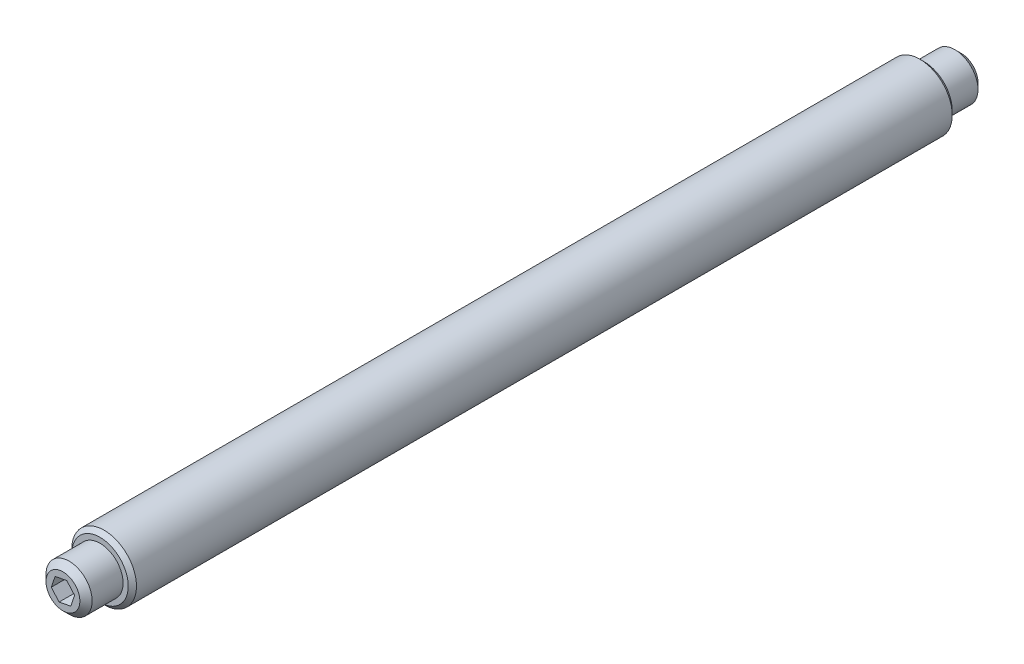
ISO-10303-21;
HEADER;
FILE_DESCRIPTION(('STEP AP214'),'2;1');
FILE_NAME('part.step','',(''),(''),'','','');
FILE_SCHEMA(('AUTOMOTIVE_DESIGN { 1 0 10303 214 1 1 1 1 }'));
ENDSEC;
DATA;
#1=APPLICATION_CONTEXT('core data for automotive mechanical design processes');
#2=APPLICATION_PROTOCOL_DEFINITION('international standard','automotive_design',2000,#1);
#3=PRODUCT_CONTEXT('',#1,'mechanical');
#4=PRODUCT('Part','Part','',(#3));
#5=PRODUCT_RELATED_PRODUCT_CATEGORY('part','',(#4));
#6=PRODUCT_DEFINITION_FORMATION('','',#4);
#7=PRODUCT_DEFINITION_CONTEXT('part definition',#1,'design');
#8=PRODUCT_DEFINITION('design','',#6,#7);
#9=PRODUCT_DEFINITION_SHAPE('','',#8);
#10=(LENGTH_UNIT() NAMED_UNIT(*) SI_UNIT(.MILLI.,.METRE.));
#11=(NAMED_UNIT(*) PLANE_ANGLE_UNIT() SI_UNIT($,.RADIAN.));
#12=(NAMED_UNIT(*) SI_UNIT($,.STERADIAN.) SOLID_ANGLE_UNIT());
#13=UNCERTAINTY_MEASURE_WITH_UNIT(LENGTH_MEASURE(1.E-05),#10,'distance_accuracy_value','');
#14=(GEOMETRIC_REPRESENTATION_CONTEXT(3) GLOBAL_UNCERTAINTY_ASSIGNED_CONTEXT((#13)) GLOBAL_UNIT_ASSIGNED_CONTEXT((#10,
#11,#12)) REPRESENTATION_CONTEXT('',''));
#15=CARTESIAN_POINT('',(0.,0.,0.));
#16=DIRECTION('',(0.,0.,1.));
#17=DIRECTION('',(1.,0.,0.));
#18=AXIS2_PLACEMENT_3D('',#15,#16,#17);
#19=CARTESIAN_POINT('',(0.,0.,-27.686));
#20=DIRECTION('',(0.,0.,-1.));
#21=DIRECTION('',(0.581899768914632,-0.813260511113812,0.));
#22=AXIS2_PLACEMENT_3D('',#19,#20,#21);
#23=PLANE('',#22);
#24=CARTESIAN_POINT('',(0.,0.,-27.686));
#25=DIRECTION('',(0.,0.,-1.));
#26=DIRECTION('',(0.581899768914632,-0.813260511113812,0.));
#27=AXIS2_PLACEMENT_3D('',#24,#25,#26);
#28=CIRCLE('',#27,1.04394);
#29=CARTESIAN_POINT('',(0.607468444760741,-0.848995177972151,-27.686));
#30=VERTEX_POINT('',#29);
#31=EDGE_CURVE('P0_E11',#30,#30,#28,.T.);
#32=ORIENTED_EDGE('',*,*,#31,.T.);
#33=EDGE_LOOP('',(#32));
#34=FACE_BOUND('',#33,.T.);
#35=DIRECTION('',(-0.581899768914632,0.813260511113812,0.));
#36=VECTOR('',#35,1.);
#37=CARTESIAN_POINT('',(-0.303085832034879,-0.667661824393953,-27.686));
#38=LINE('',#37,#36);
#39=CARTESIAN_POINT('',(-0.303085832034879,-0.667661824393953,-27.686));
#40=VERTEX_POINT('',#39);
#41=CARTESIAN_POINT('',(-0.729755017079668,-0.0713508821276313,-27.686));
#42=VERTEX_POINT('',#41);
#43=EDGE_CURVE('P0_E78',#40,#42,#38,.T.);
#44=ORIENTED_EDGE('',*,*,#43,.F.);
#45=DIRECTION('',(0.995254146976594,0.0973097267794597,0.));
#46=VECTOR('',#45,1.);
#47=CARTESIAN_POINT('',(-0.303085832034879,-0.667661824393953,-27.686));
#48=LINE('',#47,#46);
#49=CARTESIAN_POINT('',(0.426669185044786,-0.596310942266323,-27.686));
#50=VERTEX_POINT('',#49);
#51=EDGE_CURVE('P0_E31',#40,#50,#48,.T.);
#52=ORIENTED_EDGE('',*,*,#51,.T.);
#53=DIRECTION('',(-0.413354378061962,-0.910570237893272,0.));
#54=VECTOR('',#53,1.);
#55=CARTESIAN_POINT('',(0.729755017079662,0.0713508821276294,-27.686));
#56=LINE('',#55,#54);
#57=CARTESIAN_POINT('',(0.729755017079662,0.0713508821276294,-27.686));
#58=VERTEX_POINT('',#57);
#59=EDGE_CURVE('P0_E84',#58,#50,#56,.T.);
#60=ORIENTED_EDGE('',*,*,#59,.F.);
#61=DIRECTION('',(-0.581899768914632,0.813260511113812,0.));
#62=VECTOR('',#61,1.);
#63=CARTESIAN_POINT('',(0.729755017079662,0.0713508821276294,-27.686));
#64=LINE('',#63,#62);
#65=CARTESIAN_POINT('',(0.303085832034872,0.667661824393951,-27.686));
#66=VERTEX_POINT('',#65);
#67=EDGE_CURVE('P0_E104',#58,#66,#64,.T.);
#68=ORIENTED_EDGE('',*,*,#67,.T.);
#69=DIRECTION('',(-0.995254146976594,-0.0973097267794598,0.));
#70=VECTOR('',#69,1.);
#71=CARTESIAN_POINT('',(0.303085832034872,0.667661824393951,-27.686));
#72=LINE('',#71,#70);
#73=CARTESIAN_POINT('',(-0.426669185044793,0.596310942266321,-27.686));
#74=VERTEX_POINT('',#73);
#75=EDGE_CURVE('P0_E107',#66,#74,#72,.T.);
#76=ORIENTED_EDGE('',*,*,#75,.T.);
#77=DIRECTION('',(0.413354378061962,0.910570237893272,0.));
#78=VECTOR('',#77,1.);
#79=CARTESIAN_POINT('',(-0.729755017079668,-0.0713508821276313,-27.686));
#80=LINE('',#79,#78);
#81=EDGE_CURVE('P0_E110',#42,#74,#80,.T.);
#82=ORIENTED_EDGE('',*,*,#81,.F.);
#83=EDGE_LOOP('',(#44,#52,#60,#68,#76,#82));
#84=FACE_BOUND('',#83,.T.);
#85=ADVANCED_FACE('P0_F17',(#34,#84),#23,.T.);
#86=CARTESIAN_POINT('',(0.,0.,-27.686));
#87=DIRECTION('',(0.,0.,1.));
#88=DIRECTION('',(-0.581899768914632,0.813260511113812,0.));
#89=AXIS2_PLACEMENT_3D('',#86,#87,#88);
#90=CONICAL_SURFACE('',#89,1.04394,0.785398163397426);
#91=CARTESIAN_POINT('',(0.,0.,-27.30754));
#92=DIRECTION('',(0.,0.,-1.));
#93=DIRECTION('',(0.581899768914632,-0.813260511113812,0.));
#94=AXIS2_PLACEMENT_3D('',#91,#92,#93);
#95=CIRCLE('',#94,1.4224);
#96=CARTESIAN_POINT('',(0.827694231304173,-1.15678175100828,-27.30754));
#97=VERTEX_POINT('',#96);
#98=EDGE_CURVE('P0_E24',#97,#97,#95,.T.);
#99=ORIENTED_EDGE('',*,*,#98,.T.);
#100=EDGE_LOOP('',(#99));
#101=FACE_BOUND('',#100,.T.);
#102=ORIENTED_EDGE('',*,*,#31,.F.);
#103=EDGE_LOOP('',(#102));
#104=FACE_BOUND('',#103,.T.);
#105=ADVANCED_FACE('P0_F130',(#101,#104),#90,.T.);
#106=CARTESIAN_POINT('',(0.,0.,-40.386));
#107=DIRECTION('',(0.,0.,-1.));
#108=DIRECTION('',(0.581899768914632,-0.813260511113812,0.));
#109=AXIS2_PLACEMENT_3D('',#106,#107,#108);
#110=CYLINDRICAL_SURFACE('',#109,1.4224);
#111=CARTESIAN_POINT('',(0.,0.,-21.9837));
#112=DIRECTION('',(0.,0.,-1.));
#113=DIRECTION('',(0.581899768914632,-0.813260511113812,0.));
#114=AXIS2_PLACEMENT_3D('',#111,#112,#113);
#115=CIRCLE('',#114,1.4224);
#116=CARTESIAN_POINT('',(0.827694231304173,-1.15678175100828,-21.9837));
#117=VERTEX_POINT('',#116);
#118=EDGE_CURVE('P0_E125',#117,#117,#115,.T.);
#119=ORIENTED_EDGE('',*,*,#118,.T.);
#120=EDGE_LOOP('',(#119));
#121=FACE_BOUND('',#120,.T.);
#122=ORIENTED_EDGE('',*,*,#98,.F.);
#123=EDGE_LOOP('',(#122));
#124=FACE_BOUND('',#123,.T.);
#125=ADVANCED_FACE('P0_F133',(#121,#124),#110,.T.);
#126=CARTESIAN_POINT('',(0.,0.,-21.9837));
#127=DIRECTION('',(0.,0.,-1.));
#128=DIRECTION('',(0.581899768914632,-0.813260511113812,0.));
#129=AXIS2_PLACEMENT_3D('',#126,#127,#128);
#130=CONICAL_SURFACE('',#129,1.4224,0.785398163397453);
#131=CARTESIAN_POINT('',(0.,0.,-21.336));
#132=DIRECTION('',(0.,0.,-1.));
#133=DIRECTION('',(0.581899768914632,-0.813260511113812,0.));
#134=AXIS2_PLACEMENT_3D('',#131,#132,#133);
#135=CIRCLE('',#134,0.7747);
#136=CARTESIAN_POINT('',(0.450797750978165,-0.630032917959867,-21.336));
#137=VERTEX_POINT('',#136);
#138=EDGE_CURVE('P0_E85',#137,#137,#135,.T.);
#139=ORIENTED_EDGE('',*,*,#138,.T.);
#140=EDGE_LOOP('',(#139));
#141=FACE_BOUND('',#140,.T.);
#142=ORIENTED_EDGE('',*,*,#118,.F.);
#143=EDGE_LOOP('',(#142));
#144=FACE_BOUND('',#143,.T.);
#145=ADVANCED_FACE('P0_F135',(#141,#144),#130,.T.);
#146=CARTESIAN_POINT('',(0.,0.,-21.8014867215606));
#147=DIRECTION('',(0.,0.,1.));
#148=DIRECTION('',(-0.581899768914632,0.813260511113812,0.));
#149=AXIS2_PLACEMENT_3D('',#146,#147,#148);
#150=CONICAL_SURFACE('',#149,0.,1.02974425867666);
#151=ORIENTED_EDGE('',*,*,#138,.F.);
#152=EDGE_LOOP('',(#151));
#153=FACE_BOUND('',#152,.T.);
#154=CARTESIAN_POINT('',(0.,0.,-21.8014867215606));
#155=VERTEX_POINT('',#154);
#156=VERTEX_LOOP('',#155);
#157=FACE_BOUND('',#156,.T.);
#158=ADVANCED_FACE('P0_F143',(#153,#157),#150,.F.);
#159=CARTESIAN_POINT('',(-0.303085832034879,-0.667661824393953,-25.908));
#160=DIRECTION('',(-0.0973097267794596,0.995254146976594,0.));
#161=DIRECTION('',(-0.995254146976594,-0.0973097267794596,0.));
#162=AXIS2_PLACEMENT_3D('',#159,#160,#161);
#163=PLANE('',#162);
#164=ORIENTED_EDGE('',*,*,#51,.F.);
#165=DIRECTION('',(0.,0.,-1.));
#166=VECTOR('',#165,1.);
#167=CARTESIAN_POINT('',(-0.303085832034879,-0.667661824393953,-25.908));
#168=LINE('',#167,#166);
#169=CARTESIAN_POINT('',(-0.303085832034879,-0.667661824393953,-25.908));
#170=VERTEX_POINT('',#169);
#171=EDGE_CURVE('P0_E72',#170,#40,#168,.T.);
#172=ORIENTED_EDGE('',*,*,#171,.F.);
#173=DIRECTION('',(0.995254146976594,0.0973097267794597,0.));
#174=VECTOR('',#173,1.);
#175=CARTESIAN_POINT('',(-0.303085832034879,-0.667661824393953,-25.908));
#176=LINE('',#175,#174);
#177=CARTESIAN_POINT('',(0.426669185044786,-0.596310942266323,-25.908));
#178=VERTEX_POINT('',#177);
#179=EDGE_CURVE('P0_E67',#170,#178,#176,.T.);
#180=ORIENTED_EDGE('',*,*,#179,.T.);
#181=DIRECTION('',(0.,0.,-1.));
#182=VECTOR('',#181,1.);
#183=CARTESIAN_POINT('',(0.426669185044786,-0.596310942266323,-25.908));
#184=LINE('',#183,#182);
#185=EDGE_CURVE('P0_E70',#178,#50,#184,.T.);
#186=ORIENTED_EDGE('',*,*,#185,.T.);
#187=EDGE_LOOP('',(#164,#172,#180,#186));
#188=FACE_BOUND('',#187,.T.);
#189=ADVANCED_FACE('P0_F69',(#188),#163,.T.);
#190=CARTESIAN_POINT('',(0.729755017079662,0.0713508821276297,-25.908));
#191=DIRECTION('',(0.910570237893272,-0.413354378061961,0.));
#192=DIRECTION('',(0.413354378061962,0.910570237893272,0.));
#193=AXIS2_PLACEMENT_3D('',#190,#191,#192);
#194=PLANE('',#193);
#195=ORIENTED_EDGE('',*,*,#59,.T.);
#196=ORIENTED_EDGE('',*,*,#185,.F.);
#197=DIRECTION('',(-0.413354378061962,-0.910570237893272,0.));
#198=VECTOR('',#197,1.);
#199=CARTESIAN_POINT('',(0.729755017079662,0.0713508821276297,-25.908));
#200=LINE('',#199,#198);
#201=CARTESIAN_POINT('',(0.729755017079662,0.0713508821276297,-25.908));
#202=VERTEX_POINT('',#201);
#203=EDGE_CURVE('P0_E77',#202,#178,#200,.T.);
#204=ORIENTED_EDGE('',*,*,#203,.F.);
#205=DIRECTION('',(0.,0.,-1.));
#206=VECTOR('',#205,1.);
#207=CARTESIAN_POINT('',(0.729755017079662,0.0713508821276297,-25.908));
#208=LINE('',#207,#206);
#209=EDGE_CURVE('P0_E86',#202,#58,#208,.T.);
#210=ORIENTED_EDGE('',*,*,#209,.T.);
#211=EDGE_LOOP('',(#195,#196,#204,#210));
#212=FACE_BOUND('',#211,.T.);
#213=ADVANCED_FACE('P0_F82',(#212),#194,.F.);
#214=CARTESIAN_POINT('',(0.729755017079662,0.0713508821276297,-25.908));
#215=DIRECTION('',(-0.813260511113812,-0.581899768914632,0.));
#216=DIRECTION('',(0.581899768914632,-0.813260511113812,0.));
#217=AXIS2_PLACEMENT_3D('',#214,#215,#216);
#218=PLANE('',#217);
#219=ORIENTED_EDGE('',*,*,#67,.F.);
#220=ORIENTED_EDGE('',*,*,#209,.F.);
#221=DIRECTION('',(-0.581899768914632,0.813260511113812,0.));
#222=VECTOR('',#221,1.);
#223=CARTESIAN_POINT('',(0.729755017079662,0.0713508821276297,-25.908));
#224=LINE('',#223,#222);
#225=CARTESIAN_POINT('',(0.303085832034872,0.667661824393951,-25.908));
#226=VERTEX_POINT('',#225);
#227=EDGE_CURVE('P0_E91',#202,#226,#224,.T.);
#228=ORIENTED_EDGE('',*,*,#227,.T.);
#229=DIRECTION('',(0.,0.,-1.));
#230=VECTOR('',#229,1.);
#231=CARTESIAN_POINT('',(0.303085832034872,0.667661824393951,-25.908));
#232=LINE('',#231,#230);
#233=EDGE_CURVE('P0_E120',#226,#66,#232,.T.);
#234=ORIENTED_EDGE('',*,*,#233,.T.);
#235=EDGE_LOOP('',(#219,#220,#228,#234));
#236=FACE_BOUND('',#235,.T.);
#237=ADVANCED_FACE('P0_F166',(#236),#218,.T.);
#238=CARTESIAN_POINT('',(0.303085832034872,0.667661824393951,-25.908));
#239=DIRECTION('',(0.0973097267794598,-0.995254146976594,0.));
#240=DIRECTION('',(0.995254146976594,0.0973097267794598,0.));
#241=AXIS2_PLACEMENT_3D('',#238,#239,#240);
#242=PLANE('',#241);
#243=ORIENTED_EDGE('',*,*,#75,.F.);
#244=ORIENTED_EDGE('',*,*,#233,.F.);
#245=DIRECTION('',(-0.995254146976594,-0.0973097267794598,0.));
#246=VECTOR('',#245,1.);
#247=CARTESIAN_POINT('',(0.303085832034872,0.667661824393951,-25.908));
#248=LINE('',#247,#246);
#249=CARTESIAN_POINT('',(-0.426669185044793,0.596310942266321,-25.908));
#250=VERTEX_POINT('',#249);
#251=EDGE_CURVE('P0_E93',#226,#250,#248,.T.);
#252=ORIENTED_EDGE('',*,*,#251,.T.);
#253=DIRECTION('',(0.,0.,-1.));
#254=VECTOR('',#253,1.);
#255=CARTESIAN_POINT('',(-0.426669185044793,0.596310942266321,-25.908));
#256=LINE('',#255,#254);
#257=EDGE_CURVE('P0_E118',#250,#74,#256,.T.);
#258=ORIENTED_EDGE('',*,*,#257,.T.);
#259=EDGE_LOOP('',(#243,#244,#252,#258));
#260=FACE_BOUND('',#259,.T.);
#261=ADVANCED_FACE('P0_F162',(#260),#242,.T.);
#262=CARTESIAN_POINT('',(-0.729755017079668,-0.0713508821276311,-25.908));
#263=DIRECTION('',(-0.910570237893272,0.413354378061962,0.));
#264=DIRECTION('',(-0.413354378061962,-0.910570237893272,0.));
#265=AXIS2_PLACEMENT_3D('',#262,#263,#264);
#266=PLANE('',#265);
#267=ORIENTED_EDGE('',*,*,#81,.T.);
#268=ORIENTED_EDGE('',*,*,#257,.F.);
#269=DIRECTION('',(0.413354378061962,0.910570237893272,0.));
#270=VECTOR('',#269,1.);
#271=CARTESIAN_POINT('',(-0.729755017079668,-0.0713508821276311,-25.908));
#272=LINE('',#271,#270);
#273=CARTESIAN_POINT('',(-0.729755017079668,-0.0713508821276311,-25.908));
#274=VERTEX_POINT('',#273);
#275=EDGE_CURVE('P0_E97',#274,#250,#272,.T.);
#276=ORIENTED_EDGE('',*,*,#275,.F.);
#277=DIRECTION('',(0.,0.,-1.));
#278=VECTOR('',#277,1.);
#279=CARTESIAN_POINT('',(-0.729755017079668,-0.0713508821276311,-25.908));
#280=LINE('',#279,#278);
#281=EDGE_CURVE('P0_E116',#274,#42,#280,.T.);
#282=ORIENTED_EDGE('',*,*,#281,.T.);
#283=EDGE_LOOP('',(#267,#268,#276,#282));
#284=FACE_BOUND('',#283,.T.);
#285=ADVANCED_FACE('P0_F159',(#284),#266,.F.);
#286=CARTESIAN_POINT('',(-0.303085832034879,-0.667661824393953,-25.908));
#287=DIRECTION('',(-0.813260511113812,-0.581899768914632,0.));
#288=DIRECTION('',(0.581899768914632,-0.813260511113812,0.));
#289=AXIS2_PLACEMENT_3D('',#286,#287,#288);
#290=PLANE('',#289);
#291=ORIENTED_EDGE('',*,*,#43,.T.);
#292=ORIENTED_EDGE('',*,*,#281,.F.);
#293=DIRECTION('',(-0.581899768914632,0.813260511113812,0.));
#294=VECTOR('',#293,1.);
#295=CARTESIAN_POINT('',(-0.303085832034879,-0.667661824393953,-25.908));
#296=LINE('',#295,#294);
#297=EDGE_CURVE('P0_E100',#170,#274,#296,.T.);
#298=ORIENTED_EDGE('',*,*,#297,.F.);
#299=ORIENTED_EDGE('',*,*,#171,.T.);
#300=EDGE_LOOP('',(#291,#292,#298,#299));
#301=FACE_BOUND('',#300,.T.);
#302=ADVANCED_FACE('P0_F155',(#301),#290,.F.);
#303=CARTESIAN_POINT('',(0.426669185044786,-0.596310942266323,-25.908));
#304=DIRECTION('',(0.,0.,-1.));
#305=DIRECTION('',(0.581899768914632,-0.813260511113812,0.));
#306=AXIS2_PLACEMENT_3D('',#303,#304,#305);
#307=PLANE('',#306);
#308=ORIENTED_EDGE('',*,*,#179,.F.);
#309=ORIENTED_EDGE('',*,*,#297,.T.);
#310=ORIENTED_EDGE('',*,*,#275,.T.);
#311=ORIENTED_EDGE('',*,*,#251,.F.);
#312=ORIENTED_EDGE('',*,*,#227,.F.);
#313=ORIENTED_EDGE('',*,*,#203,.T.);
#314=EDGE_LOOP('',(#308,#309,#310,#311,#312,#313));
#315=FACE_BOUND('',#314,.T.);
#316=ADVANCED_FACE('P0_F89',(#315),#307,.T.);
#317=CLOSED_SHELL('',(#85,#105,#125,#145,#158,#189,#213,#237,#261,#285,#302,#316));
#318=MANIFOLD_SOLID_BREP('P0_B1',#317);
#319=CARTESIAN_POINT('',(0.,0.,25.4));
#320=DIRECTION('',(0.,0.,-1.));
#321=DIRECTION('',(-1.,0.,0.));
#322=AXIS2_PLACEMENT_3D('',#319,#320,#321);
#323=CYLINDRICAL_SURFACE('',#322,1.9939);
#324=CARTESIAN_POINT('',(0.,0.,25.146));
#325=DIRECTION('',(0.,0.,1.));
#326=DIRECTION('',(1.,0.,0.));
#327=AXIS2_PLACEMENT_3D('',#324,#325,#326);
#328=CIRCLE('',#327,1.9939);
#329=CARTESIAN_POINT('',(1.9939,0.,25.146));
#330=VERTEX_POINT('',#329);
#331=EDGE_CURVE('P1_E11',#330,#330,#328,.F.);
#332=ORIENTED_EDGE('',*,*,#331,.T.);
#333=EDGE_LOOP('',(#332));
#334=FACE_BOUND('',#333,.T.);
#335=CARTESIAN_POINT('',(0.,0.,-25.146));
#336=DIRECTION('',(0.,0.,1.));
#337=DIRECTION('',(1.,0.,0.));
#338=AXIS2_PLACEMENT_3D('',#335,#336,#337);
#339=CIRCLE('',#338,1.9939);
#340=CARTESIAN_POINT('',(1.9939,0.,-25.146));
#341=VERTEX_POINT('',#340);
#342=EDGE_CURVE('P1_E63',#341,#341,#339,.T.);
#343=ORIENTED_EDGE('',*,*,#342,.T.);
#344=EDGE_LOOP('',(#343));
#345=FACE_BOUND('',#344,.T.);
#346=ADVANCED_FACE('P1_F17',(#334,#345),#323,.T.);
#347=CARTESIAN_POINT('',(0.,0.,25.4));
#348=DIRECTION('',(0.,0.,1.));
#349=DIRECTION('',(1.,0.,0.));
#350=AXIS2_PLACEMENT_3D('',#347,#348,#349);
#351=PLANE('',#350);
#352=CARTESIAN_POINT('',(0.,0.,25.4));
#353=DIRECTION('',(0.,0.,1.));
#354=DIRECTION('',(1.,0.,0.));
#355=AXIS2_PLACEMENT_3D('',#352,#353,#354);
#356=CIRCLE('',#355,1.42239999999999);
#357=CARTESIAN_POINT('',(1.42239999999999,0.,25.4));
#358=VERTEX_POINT('',#357);
#359=EDGE_CURVE('P1_E60',#358,#358,#356,.T.);
#360=ORIENTED_EDGE('',*,*,#359,.F.);
#361=EDGE_LOOP('',(#360));
#362=FACE_BOUND('',#361,.T.);
#363=CARTESIAN_POINT('',(0.,0.,25.4));
#364=DIRECTION('',(0.,0.,1.));
#365=DIRECTION('',(1.,0.,0.));
#366=AXIS2_PLACEMENT_3D('',#363,#364,#365);
#367=CIRCLE('',#366,1.7399);
#368=CARTESIAN_POINT('',(1.7399,0.,25.4));
#369=VERTEX_POINT('',#368);
#370=EDGE_CURVE('P1_E25',#369,#369,#367,.T.);
#371=ORIENTED_EDGE('',*,*,#370,.T.);
#372=EDGE_LOOP('',(#371));
#373=FACE_BOUND('',#372,.T.);
#374=ADVANCED_FACE('P1_F71',(#362,#373),#351,.T.);
#375=CARTESIAN_POINT('',(0.,0.,-25.4));
#376=DIRECTION('',(0.,0.,1.));
#377=DIRECTION('',(1.,0.,0.));
#378=AXIS2_PLACEMENT_3D('',#375,#376,#377);
#379=PLANE('',#378);
#380=CARTESIAN_POINT('',(0.,0.,-25.4));
#381=DIRECTION('',(0.,0.,-1.));
#382=DIRECTION('',(-1.,0.,0.));
#383=AXIS2_PLACEMENT_3D('',#380,#381,#382);
#384=CIRCLE('',#383,1.42239999999999);
#385=CARTESIAN_POINT('',(-1.42239999999999,0.,-25.4));
#386=VERTEX_POINT('',#385);
#387=EDGE_CURVE('P1_E48',#386,#386,#384,.T.);
#388=ORIENTED_EDGE('',*,*,#387,.F.);
#389=EDGE_LOOP('',(#388));
#390=FACE_BOUND('',#389,.T.);
#391=CARTESIAN_POINT('',(0.,0.,-25.4));
#392=DIRECTION('',(0.,0.,1.));
#393=DIRECTION('',(1.,0.,0.));
#394=AXIS2_PLACEMENT_3D('',#391,#392,#393);
#395=CIRCLE('',#394,1.7399);
#396=CARTESIAN_POINT('',(1.7399,0.,-25.4));
#397=VERTEX_POINT('',#396);
#398=EDGE_CURVE('P1_E66',#397,#397,#395,.F.);
#399=ORIENTED_EDGE('',*,*,#398,.T.);
#400=EDGE_LOOP('',(#399));
#401=FACE_BOUND('',#400,.T.);
#402=ADVANCED_FACE('P1_F86',(#390,#401),#379,.F.);
#403=CARTESIAN_POINT('',(0.,0.,-25.146));
#404=DIRECTION('',(0.,0.,1.));
#405=DIRECTION('',(1.,0.,0.));
#406=AXIS2_PLACEMENT_3D('',#403,#404,#405);
#407=CONICAL_SURFACE('',#406,1.9939,0.785398163397448);
#408=ORIENTED_EDGE('',*,*,#398,.F.);
#409=EDGE_LOOP('',(#408));
#410=FACE_BOUND('',#409,.T.);
#411=ORIENTED_EDGE('',*,*,#342,.F.);
#412=EDGE_LOOP('',(#411));
#413=FACE_BOUND('',#412,.T.);
#414=ADVANCED_FACE('P1_F75',(#410,#413),#407,.T.);
#415=CARTESIAN_POINT('',(0.,0.,25.4));
#416=DIRECTION('',(0.,0.,-1.));
#417=DIRECTION('',(-1.,0.,0.));
#418=AXIS2_PLACEMENT_3D('',#415,#416,#417);
#419=CONICAL_SURFACE('',#418,1.7399,0.785398163397448);
#420=ORIENTED_EDGE('',*,*,#331,.F.);
#421=EDGE_LOOP('',(#420));
#422=FACE_BOUND('',#421,.T.);
#423=ORIENTED_EDGE('',*,*,#370,.F.);
#424=EDGE_LOOP('',(#423));
#425=FACE_BOUND('',#424,.T.);
#426=ADVANCED_FACE('P1_F19',(#422,#425),#419,.T.);
#427=CARTESIAN_POINT('',(0.,0.,25.4));
#428=DIRECTION('',(0.,0.,1.));
#429=DIRECTION('',(1.,0.,0.));
#430=AXIS2_PLACEMENT_3D('',#427,#428,#429);
#431=CYLINDRICAL_SURFACE('',#430,1.4224);
#432=CARTESIAN_POINT('',(0.,0.,21.336));
#433=DIRECTION('',(0.,0.,1.));
#434=DIRECTION('',(1.,0.,0.));
#435=AXIS2_PLACEMENT_3D('',#432,#433,#434);
#436=CIRCLE('',#435,1.4224);
#437=CARTESIAN_POINT('',(1.4224,0.,21.336));
#438=VERTEX_POINT('',#437);
#439=EDGE_CURVE('P1_E57',#438,#438,#436,.T.);
#440=ORIENTED_EDGE('',*,*,#439,.F.);
#441=EDGE_LOOP('',(#440));
#442=FACE_BOUND('',#441,.T.);
#443=ORIENTED_EDGE('',*,*,#359,.T.);
#444=EDGE_LOOP('',(#443));
#445=FACE_BOUND('',#444,.T.);
#446=ADVANCED_FACE('P1_F74',(#442,#445),#431,.F.);
#447=CARTESIAN_POINT('',(1.1303,0.,21.336));
#448=DIRECTION('',(0.,0.,-1.));
#449=DIRECTION('',(-1.,0.,0.));
#450=AXIS2_PLACEMENT_3D('',#447,#448,#449);
#451=PLANE('',#450);
#452=CARTESIAN_POINT('',(0.,0.,21.336));
#453=DIRECTION('',(0.,0.,1.));
#454=DIRECTION('',(1.,0.,0.));
#455=AXIS2_PLACEMENT_3D('',#452,#453,#454);
#456=CIRCLE('',#455,1.1303);
#457=CARTESIAN_POINT('',(1.1303,0.,21.336));
#458=VERTEX_POINT('',#457);
#459=EDGE_CURVE('P1_E54',#458,#458,#456,.T.);
#460=ORIENTED_EDGE('',*,*,#459,.F.);
#461=EDGE_LOOP('',(#460));
#462=FACE_BOUND('',#461,.T.);
#463=ORIENTED_EDGE('',*,*,#439,.T.);
#464=EDGE_LOOP('',(#463));
#465=FACE_BOUND('',#464,.T.);
#466=ADVANCED_FACE('P1_F83',(#462,#465),#451,.F.);
#467=CARTESIAN_POINT('',(0.,0.,25.4));
#468=DIRECTION('',(0.,0.,1.));
#469=DIRECTION('',(1.,0.,0.));
#470=AXIS2_PLACEMENT_3D('',#467,#468,#469);
#471=CYLINDRICAL_SURFACE('',#470,1.1303);
#472=CARTESIAN_POINT('',(0.,0.,20.32));
#473=DIRECTION('',(0.,0.,1.));
#474=DIRECTION('',(1.,0.,0.));
#475=AXIS2_PLACEMENT_3D('',#472,#473,#474);
#476=CIRCLE('',#475,1.1303);
#477=CARTESIAN_POINT('',(1.1303,0.,20.32));
#478=VERTEX_POINT('',#477);
#479=EDGE_CURVE('P1_E51',#478,#478,#476,.T.);
#480=ORIENTED_EDGE('',*,*,#479,.F.);
#481=EDGE_LOOP('',(#480));
#482=FACE_BOUND('',#481,.T.);
#483=ORIENTED_EDGE('',*,*,#459,.T.);
#484=EDGE_LOOP('',(#483));
#485=FACE_BOUND('',#484,.T.);
#486=ADVANCED_FACE('P1_F105',(#482,#485),#471,.F.);
#487=CARTESIAN_POINT('',(0.,0.,20.32));
#488=DIRECTION('',(0.,0.,1.));
#489=DIRECTION('',(1.,0.,0.));
#490=AXIS2_PLACEMENT_3D('',#487,#488,#489);
#491=CONICAL_SURFACE('',#490,1.1303,1.02974425867665);
#492=CARTESIAN_POINT('',(0.,0.,19.6408472423131));
#493=VERTEX_POINT('',#492);
#494=VERTEX_LOOP('',#493);
#495=FACE_BOUND('',#494,.T.);
#496=ORIENTED_EDGE('',*,*,#479,.T.);
#497=EDGE_LOOP('',(#496));
#498=FACE_BOUND('',#497,.T.);
#499=ADVANCED_FACE('P1_F109',(#495,#498),#491,.F.);
#500=CARTESIAN_POINT('',(0.,0.,-25.4));
#501=DIRECTION('',(0.,0.,-1.));
#502=DIRECTION('',(-1.,0.,0.));
#503=AXIS2_PLACEMENT_3D('',#500,#501,#502);
#504=CYLINDRICAL_SURFACE('',#503,1.4224);
#505=CARTESIAN_POINT('',(0.,0.,-21.336));
#506=DIRECTION('',(0.,0.,-1.));
#507=DIRECTION('',(-1.,0.,0.));
#508=AXIS2_PLACEMENT_3D('',#505,#506,#507);
#509=CIRCLE('',#508,1.4224);
#510=CARTESIAN_POINT('',(-1.4224,0.,-21.336));
#511=VERTEX_POINT('',#510);
#512=EDGE_CURVE('P1_E43',#511,#511,#509,.T.);
#513=ORIENTED_EDGE('',*,*,#512,.F.);
#514=EDGE_LOOP('',(#513));
#515=FACE_BOUND('',#514,.T.);
#516=ORIENTED_EDGE('',*,*,#387,.T.);
#517=EDGE_LOOP('',(#516));
#518=FACE_BOUND('',#517,.T.);
#519=ADVANCED_FACE('P1_F113',(#515,#518),#504,.F.);
#520=CARTESIAN_POINT('',(1.1303,0.,-21.336));
#521=DIRECTION('',(0.,0.,1.));
#522=DIRECTION('',(1.,0.,0.));
#523=AXIS2_PLACEMENT_3D('',#520,#521,#522);
#524=PLANE('',#523);
#525=CARTESIAN_POINT('',(0.,0.,-21.336));
#526=DIRECTION('',(0.,0.,-1.));
#527=DIRECTION('',(-1.,0.,0.));
#528=AXIS2_PLACEMENT_3D('',#525,#526,#527);
#529=CIRCLE('',#528,1.1303);
#530=CARTESIAN_POINT('',(-1.1303,0.,-21.336));
#531=VERTEX_POINT('',#530);
#532=EDGE_CURVE('P1_E40',#531,#531,#529,.T.);
#533=ORIENTED_EDGE('',*,*,#532,.F.);
#534=EDGE_LOOP('',(#533));
#535=FACE_BOUND('',#534,.T.);
#536=ORIENTED_EDGE('',*,*,#512,.T.);
#537=EDGE_LOOP('',(#536));
#538=FACE_BOUND('',#537,.T.);
#539=ADVANCED_FACE('P1_F116',(#535,#538),#524,.F.);
#540=CARTESIAN_POINT('',(0.,0.,-25.4));
#541=DIRECTION('',(0.,0.,-1.));
#542=DIRECTION('',(-1.,0.,0.));
#543=AXIS2_PLACEMENT_3D('',#540,#541,#542);
#544=CYLINDRICAL_SURFACE('',#543,1.1303);
#545=CARTESIAN_POINT('',(0.,0.,-20.32));
#546=DIRECTION('',(0.,0.,-1.));
#547=DIRECTION('',(-1.,0.,0.));
#548=AXIS2_PLACEMENT_3D('',#545,#546,#547);
#549=CIRCLE('',#548,1.1303);
#550=CARTESIAN_POINT('',(-1.1303,0.,-20.32));
#551=VERTEX_POINT('',#550);
#552=EDGE_CURVE('P1_E38',#551,#551,#549,.T.);
#553=ORIENTED_EDGE('',*,*,#552,.F.);
#554=EDGE_LOOP('',(#553));
#555=FACE_BOUND('',#554,.T.);
#556=ORIENTED_EDGE('',*,*,#532,.T.);
#557=EDGE_LOOP('',(#556));
#558=FACE_BOUND('',#557,.T.);
#559=ADVANCED_FACE('P1_F34',(#555,#558),#544,.F.);
#560=CARTESIAN_POINT('',(0.,0.,-20.32));
#561=DIRECTION('',(0.,0.,-1.));
#562=DIRECTION('',(-1.,0.,0.));
#563=AXIS2_PLACEMENT_3D('',#560,#561,#562);
#564=CONICAL_SURFACE('',#563,1.1303,1.02974425867665);
#565=CARTESIAN_POINT('',(0.,0.,-19.6408472423131));
#566=VERTEX_POINT('',#565);
#567=VERTEX_LOOP('',#566);
#568=FACE_BOUND('',#567,.T.);
#569=ORIENTED_EDGE('',*,*,#552,.T.);
#570=EDGE_LOOP('',(#569));
#571=FACE_BOUND('',#570,.T.);
#572=ADVANCED_FACE('P1_F31',(#568,#571),#564,.F.);
#573=CLOSED_SHELL('',(#346,#374,#402,#414,#426,#446,#466,#486,#499,#519,#539,#559,#572));
#574=MANIFOLD_SOLID_BREP('P1_B1',#573);
#575=CARTESIAN_POINT('',(0.,0.,27.686));
#576=DIRECTION('',(0.,0.,1.));
#577=DIRECTION('',(0.981070589815727,0.193650452616621,0.));
#578=AXIS2_PLACEMENT_3D('',#575,#576,#577);
#579=PLANE('',#578);
#580=CARTESIAN_POINT('',(0.,0.,27.686));
#581=DIRECTION('',(0.,0.,1.));
#582=DIRECTION('',(0.981070589815727,0.193650452616621,0.));
#583=AXIS2_PLACEMENT_3D('',#580,#581,#582);
#584=CIRCLE('',#583,1.04394);
#585=CARTESIAN_POINT('',(1.02417883153223,0.202159453504595,27.686));
#586=VERTEX_POINT('',#585);
#587=EDGE_CURVE('P2_E10',#586,#586,#584,.T.);
#588=ORIENTED_EDGE('',*,*,#587,.T.);
#589=EDGE_LOOP('',(#588));
#590=FACE_BOUND('',#589,.T.);
#591=DIRECTION('',(-0.981070589815727,-0.193650452616622,0.));
#592=VECTOR('',#591,1.);
#593=CARTESIAN_POINT('',(0.236709531982271,0.693975454034271,27.686));
#594=LINE('',#593,#592);
#595=CARTESIAN_POINT('',(0.236709531982271,0.693975454034271,27.686));
#596=VERTEX_POINT('',#595);
#597=CARTESIAN_POINT('',(-0.48264560680538,0.551984195031709,27.686));
#598=VERTEX_POINT('',#597);
#599=EDGE_CURVE('P2_E77',#596,#598,#594,.T.);
#600=ORIENTED_EDGE('',*,*,#599,.F.);
#601=DIRECTION('',(0.658241506328213,-0.752806827377891,0.));
#602=VECTOR('',#601,1.);
#603=CARTESIAN_POINT('',(0.236709531982271,0.693975454034271,27.686));
#604=LINE('',#603,#602);
#605=CARTESIAN_POINT('',(0.719355138787651,0.141991259002566,27.686));
#606=VERTEX_POINT('',#605);
#607=EDGE_CURVE('P2_E30',#596,#606,#604,.T.);
#608=ORIENTED_EDGE('',*,*,#607,.T.);
#609=DIRECTION('',(0.322829083487515,0.946457279994513,0.));
#610=VECTOR('',#609,1.);
#611=CARTESIAN_POINT('',(0.48264560680538,-0.551984195031702,27.686));
#612=LINE('',#611,#610);
#613=CARTESIAN_POINT('',(0.48264560680538,-0.551984195031702,27.686));
#614=VERTEX_POINT('',#613);
#615=EDGE_CURVE('P2_E83',#614,#606,#612,.T.);
#616=ORIENTED_EDGE('',*,*,#615,.F.);
#617=DIRECTION('',(-0.981070589815727,-0.193650452616621,0.));
#618=VECTOR('',#617,1.);
#619=CARTESIAN_POINT('',(0.48264560680538,-0.551984195031702,27.686));
#620=LINE('',#619,#618);
#621=CARTESIAN_POINT('',(-0.236709531982271,-0.693975454034264,27.686));
#622=VERTEX_POINT('',#621);
#623=EDGE_CURVE('P2_E103',#614,#622,#620,.T.);
#624=ORIENTED_EDGE('',*,*,#623,.T.);
#625=DIRECTION('',(-0.658241506328212,0.752806827377891,0.));
#626=VECTOR('',#625,1.);
#627=CARTESIAN_POINT('',(-0.236709531982271,-0.693975454034264,27.686));
#628=LINE('',#627,#626);
#629=CARTESIAN_POINT('',(-0.719355138787651,-0.141991259002558,27.686));
#630=VERTEX_POINT('',#629);
#631=EDGE_CURVE('P2_E106',#622,#630,#628,.T.);
#632=ORIENTED_EDGE('',*,*,#631,.T.);
#633=DIRECTION('',(-0.322829083487515,-0.946457279994513,0.));
#634=VECTOR('',#633,1.);
#635=CARTESIAN_POINT('',(-0.48264560680538,0.551984195031709,27.686));
#636=LINE('',#635,#634);
#637=EDGE_CURVE('P2_E109',#598,#630,#636,.T.);
#638=ORIENTED_EDGE('',*,*,#637,.F.);
#639=EDGE_LOOP('',(#600,#608,#616,#624,#632,#638));
#640=FACE_BOUND('',#639,.T.);
#641=ADVANCED_FACE('P2_F16',(#590,#640),#579,.T.);
#642=CARTESIAN_POINT('',(0.,0.,27.686));
#643=DIRECTION('',(0.,0.,-1.));
#644=DIRECTION('',(-0.981070589815727,-0.193650452616621,0.));
#645=AXIS2_PLACEMENT_3D('',#642,#643,#644);
#646=CONICAL_SURFACE('',#645,1.04394,0.785398163397426);
#647=CARTESIAN_POINT('',(0.,0.,27.30754));
#648=DIRECTION('',(0.,0.,1.));
#649=DIRECTION('',(0.981070589815727,0.193650452616621,0.));
#650=AXIS2_PLACEMENT_3D('',#647,#648,#649);
#651=CIRCLE('',#650,1.4224);
#652=CARTESIAN_POINT('',(1.39547480695389,0.275448403801882,27.30754));
#653=VERTEX_POINT('',#652);
#654=EDGE_CURVE('P2_E23',#653,#653,#651,.T.);
#655=ORIENTED_EDGE('',*,*,#654,.T.);
#656=EDGE_LOOP('',(#655));
#657=FACE_BOUND('',#656,.T.);
#658=ORIENTED_EDGE('',*,*,#587,.F.);
#659=EDGE_LOOP('',(#658));
#660=FACE_BOUND('',#659,.T.);
#661=ADVANCED_FACE('P2_F129',(#657,#660),#646,.T.);
#662=CARTESIAN_POINT('',(0.,0.,40.386));
#663=DIRECTION('',(0.,0.,1.));
#664=DIRECTION('',(0.981070589815727,0.193650452616621,0.));
#665=AXIS2_PLACEMENT_3D('',#662,#663,#664);
#666=CYLINDRICAL_SURFACE('',#665,1.4224);
#667=CARTESIAN_POINT('',(0.,0.,21.9837));
#668=DIRECTION('',(0.,0.,1.));
#669=DIRECTION('',(0.981070589815727,0.193650452616621,0.));
#670=AXIS2_PLACEMENT_3D('',#667,#668,#669);
#671=CIRCLE('',#670,1.4224);
#672=CARTESIAN_POINT('',(1.39547480695389,0.275448403801881,21.9837));
#673=VERTEX_POINT('',#672);
#674=EDGE_CURVE('P2_E124',#673,#673,#671,.T.);
#675=ORIENTED_EDGE('',*,*,#674,.T.);
#676=EDGE_LOOP('',(#675));
#677=FACE_BOUND('',#676,.T.);
#678=ORIENTED_EDGE('',*,*,#654,.F.);
#679=EDGE_LOOP('',(#678));
#680=FACE_BOUND('',#679,.T.);
#681=ADVANCED_FACE('P2_F132',(#677,#680),#666,.T.);
#682=CARTESIAN_POINT('',(0.,0.,21.9837));
#683=DIRECTION('',(0.,0.,1.));
#684=DIRECTION('',(0.981070589815727,0.193650452616621,0.));
#685=AXIS2_PLACEMENT_3D('',#682,#683,#684);
#686=CONICAL_SURFACE('',#685,1.4224,0.785398163397453);
#687=CARTESIAN_POINT('',(0.,0.,21.336));
#688=DIRECTION('',(0.,0.,1.));
#689=DIRECTION('',(0.981070589815727,0.193650452616621,0.));
#690=AXIS2_PLACEMENT_3D('',#687,#688,#689);
#691=CIRCLE('',#690,0.7747);
#692=CARTESIAN_POINT('',(0.760035385930243,0.150021005642096,21.336));
#693=VERTEX_POINT('',#692);
#694=EDGE_CURVE('P2_E84',#693,#693,#691,.T.);
#695=ORIENTED_EDGE('',*,*,#694,.T.);
#696=EDGE_LOOP('',(#695));
#697=FACE_BOUND('',#696,.T.);
#698=ORIENTED_EDGE('',*,*,#674,.F.);
#699=EDGE_LOOP('',(#698));
#700=FACE_BOUND('',#699,.T.);
#701=ADVANCED_FACE('P2_F134',(#697,#700),#686,.T.);
#702=CARTESIAN_POINT('',(0.,0.,21.8014867215606));
#703=DIRECTION('',(0.,0.,-1.));
#704=DIRECTION('',(-0.981070589815727,-0.193650452616621,0.));
#705=AXIS2_PLACEMENT_3D('',#702,#703,#704);
#706=CONICAL_SURFACE('',#705,0.,1.02974425867666);
#707=ORIENTED_EDGE('',*,*,#694,.F.);
#708=EDGE_LOOP('',(#707));
#709=FACE_BOUND('',#708,.T.);
#710=CARTESIAN_POINT('',(0.,0.,21.8014867215606));
#711=VERTEX_POINT('',#710);
#712=VERTEX_LOOP('',#711);
#713=FACE_BOUND('',#712,.T.);
#714=ADVANCED_FACE('P2_F142',(#709,#713),#706,.F.);
#715=CARTESIAN_POINT('',(0.236709531982271,0.693975454034271,25.908));
#716=DIRECTION('',(-0.752806827377891,-0.658241506328212,0.));
#717=DIRECTION('',(-0.658241506328213,0.752806827377891,0.));
#718=AXIS2_PLACEMENT_3D('',#715,#716,#717);
#719=PLANE('',#718);
#720=ORIENTED_EDGE('',*,*,#607,.F.);
#721=DIRECTION('',(0.,0.,1.));
#722=VECTOR('',#721,1.);
#723=CARTESIAN_POINT('',(0.236709531982271,0.693975454034271,25.908));
#724=LINE('',#723,#722);
#725=CARTESIAN_POINT('',(0.236709531982271,0.693975454034271,25.908));
#726=VERTEX_POINT('',#725);
#727=EDGE_CURVE('P2_E71',#726,#596,#724,.T.);
#728=ORIENTED_EDGE('',*,*,#727,.F.);
#729=DIRECTION('',(0.658241506328213,-0.752806827377891,0.));
#730=VECTOR('',#729,1.);
#731=CARTESIAN_POINT('',(0.236709531982271,0.693975454034271,25.908));
#732=LINE('',#731,#730);
#733=CARTESIAN_POINT('',(0.719355138787651,0.141991259002566,25.908));
#734=VERTEX_POINT('',#733);
#735=EDGE_CURVE('P2_E66',#726,#734,#732,.T.);
#736=ORIENTED_EDGE('',*,*,#735,.T.);
#737=DIRECTION('',(0.,0.,1.));
#738=VECTOR('',#737,1.);
#739=CARTESIAN_POINT('',(0.719355138787651,0.141991259002566,25.908));
#740=LINE('',#739,#738);
#741=EDGE_CURVE('P2_E69',#734,#606,#740,.T.);
#742=ORIENTED_EDGE('',*,*,#741,.T.);
#743=EDGE_LOOP('',(#720,#728,#736,#742));
#744=FACE_BOUND('',#743,.T.);
#745=ADVANCED_FACE('P2_F68',(#744),#719,.T.);
#746=CARTESIAN_POINT('',(0.48264560680538,-0.551984195031702,25.908));
#747=DIRECTION('',(0.946457279994513,-0.322829083487515,0.));
#748=DIRECTION('',(-0.322829083487515,-0.946457279994513,0.));
#749=AXIS2_PLACEMENT_3D('',#746,#747,#748);
#750=PLANE('',#749);
#751=ORIENTED_EDGE('',*,*,#615,.T.);
#752=ORIENTED_EDGE('',*,*,#741,.F.);
#753=DIRECTION('',(0.322829083487515,0.946457279994513,0.));
#754=VECTOR('',#753,1.);
#755=CARTESIAN_POINT('',(0.48264560680538,-0.551984195031702,25.908));
#756=LINE('',#755,#754);
#757=CARTESIAN_POINT('',(0.48264560680538,-0.551984195031702,25.908));
#758=VERTEX_POINT('',#757);
#759=EDGE_CURVE('P2_E76',#758,#734,#756,.T.);
#760=ORIENTED_EDGE('',*,*,#759,.F.);
#761=DIRECTION('',(0.,0.,1.));
#762=VECTOR('',#761,1.);
#763=CARTESIAN_POINT('',(0.48264560680538,-0.551984195031702,25.908));
#764=LINE('',#763,#762);
#765=EDGE_CURVE('P2_E85',#758,#614,#764,.T.);
#766=ORIENTED_EDGE('',*,*,#765,.T.);
#767=EDGE_LOOP('',(#751,#752,#760,#766));
#768=FACE_BOUND('',#767,.T.);
#769=ADVANCED_FACE('P2_F81',(#768),#750,.F.);
#770=CARTESIAN_POINT('',(0.48264560680538,-0.551984195031702,25.908));
#771=DIRECTION('',(-0.193650452616621,0.981070589815727,0.));
#772=DIRECTION('',(0.981070589815727,0.193650452616621,0.));
#773=AXIS2_PLACEMENT_3D('',#770,#771,#772);
#774=PLANE('',#773);
#775=ORIENTED_EDGE('',*,*,#623,.F.);
#776=ORIENTED_EDGE('',*,*,#765,.F.);
#777=DIRECTION('',(-0.981070589815727,-0.193650452616621,0.));
#778=VECTOR('',#777,1.);
#779=CARTESIAN_POINT('',(0.48264560680538,-0.551984195031702,25.908));
#780=LINE('',#779,#778);
#781=CARTESIAN_POINT('',(-0.236709531982271,-0.693975454034264,25.908));
#782=VERTEX_POINT('',#781);
#783=EDGE_CURVE('P2_E90',#758,#782,#780,.T.);
#784=ORIENTED_EDGE('',*,*,#783,.T.);
#785=DIRECTION('',(0.,0.,1.));
#786=VECTOR('',#785,1.);
#787=CARTESIAN_POINT('',(-0.236709531982271,-0.693975454034264,25.908));
#788=LINE('',#787,#786);
#789=EDGE_CURVE('P2_E119',#782,#622,#788,.T.);
#790=ORIENTED_EDGE('',*,*,#789,.T.);
#791=EDGE_LOOP('',(#775,#776,#784,#790));
#792=FACE_BOUND('',#791,.T.);
#793=ADVANCED_FACE('P2_F165',(#792),#774,.T.);
#794=CARTESIAN_POINT('',(-0.236709531982271,-0.693975454034264,25.908));
#795=DIRECTION('',(0.752806827377892,0.658241506328212,0.));
#796=DIRECTION('',(0.658241506328212,-0.752806827377892,0.));
#797=AXIS2_PLACEMENT_3D('',#794,#795,#796);
#798=PLANE('',#797);
#799=ORIENTED_EDGE('',*,*,#631,.F.);
#800=ORIENTED_EDGE('',*,*,#789,.F.);
#801=DIRECTION('',(-0.658241506328212,0.752806827377891,0.));
#802=VECTOR('',#801,1.);
#803=CARTESIAN_POINT('',(-0.236709531982271,-0.693975454034264,25.908));
#804=LINE('',#803,#802);
#805=CARTESIAN_POINT('',(-0.719355138787651,-0.141991259002559,25.908));
#806=VERTEX_POINT('',#805);
#807=EDGE_CURVE('P2_E92',#782,#806,#804,.T.);
#808=ORIENTED_EDGE('',*,*,#807,.T.);
#809=DIRECTION('',(0.,0.,1.));
#810=VECTOR('',#809,1.);
#811=CARTESIAN_POINT('',(-0.719355138787651,-0.141991259002559,25.908));
#812=LINE('',#811,#810);
#813=EDGE_CURVE('P2_E117',#806,#630,#812,.T.);
#814=ORIENTED_EDGE('',*,*,#813,.T.);
#815=EDGE_LOOP('',(#799,#800,#808,#814));
#816=FACE_BOUND('',#815,.T.);
#817=ADVANCED_FACE('P2_F161',(#816),#798,.T.);
#818=CARTESIAN_POINT('',(-0.48264560680538,0.551984195031709,25.908));
#819=DIRECTION('',(-0.946457279994513,0.322829083487515,0.));
#820=DIRECTION('',(0.322829083487515,0.946457279994513,0.));
#821=AXIS2_PLACEMENT_3D('',#818,#819,#820);
#822=PLANE('',#821);
#823=ORIENTED_EDGE('',*,*,#637,.T.);
#824=ORIENTED_EDGE('',*,*,#813,.F.);
#825=DIRECTION('',(-0.322829083487515,-0.946457279994513,0.));
#826=VECTOR('',#825,1.);
#827=CARTESIAN_POINT('',(-0.48264560680538,0.551984195031709,25.908));
#828=LINE('',#827,#826);
#829=CARTESIAN_POINT('',(-0.48264560680538,0.551984195031709,25.908));
#830=VERTEX_POINT('',#829);
#831=EDGE_CURVE('P2_E96',#830,#806,#828,.T.);
#832=ORIENTED_EDGE('',*,*,#831,.F.);
#833=DIRECTION('',(0.,0.,1.));
#834=VECTOR('',#833,1.);
#835=CARTESIAN_POINT('',(-0.48264560680538,0.551984195031709,25.908));
#836=LINE('',#835,#834);
#837=EDGE_CURVE('P2_E115',#830,#598,#836,.T.);
#838=ORIENTED_EDGE('',*,*,#837,.T.);
#839=EDGE_LOOP('',(#823,#824,#832,#838));
#840=FACE_BOUND('',#839,.T.);
#841=ADVANCED_FACE('P2_F158',(#840),#822,.F.);
#842=CARTESIAN_POINT('',(0.236709531982271,0.693975454034271,25.908));
#843=DIRECTION('',(-0.193650452616622,0.981070589815727,0.));
#844=DIRECTION('',(0.981070589815727,0.193650452616622,0.));
#845=AXIS2_PLACEMENT_3D('',#842,#843,#844);
#846=PLANE('',#845);
#847=ORIENTED_EDGE('',*,*,#599,.T.);
#848=ORIENTED_EDGE('',*,*,#837,.F.);
#849=DIRECTION('',(-0.981070589815727,-0.193650452616622,0.));
#850=VECTOR('',#849,1.);
#851=CARTESIAN_POINT('',(0.236709531982271,0.693975454034271,25.908));
#852=LINE('',#851,#850);
#853=EDGE_CURVE('P2_E99',#726,#830,#852,.T.);
#854=ORIENTED_EDGE('',*,*,#853,.F.);
#855=ORIENTED_EDGE('',*,*,#727,.T.);
#856=EDGE_LOOP('',(#847,#848,#854,#855));
#857=FACE_BOUND('',#856,.T.);
#858=ADVANCED_FACE('P2_F154',(#857),#846,.F.);
#859=CARTESIAN_POINT('',(0.719355138787651,0.141991259002566,25.908));
#860=DIRECTION('',(0.,0.,1.));
#861=DIRECTION('',(0.981070589815727,0.193650452616621,0.));
#862=AXIS2_PLACEMENT_3D('',#859,#860,#861);
#863=PLANE('',#862);
#864=ORIENTED_EDGE('',*,*,#735,.F.);
#865=ORIENTED_EDGE('',*,*,#853,.T.);
#866=ORIENTED_EDGE('',*,*,#831,.T.);
#867=ORIENTED_EDGE('',*,*,#807,.F.);
#868=ORIENTED_EDGE('',*,*,#783,.F.);
#869=ORIENTED_EDGE('',*,*,#759,.T.);
#870=EDGE_LOOP('',(#864,#865,#866,#867,#868,#869));
#871=FACE_BOUND('',#870,.T.);
#872=ADVANCED_FACE('P2_F88',(#871),#863,.T.);
#873=CLOSED_SHELL('',(#641,#661,#681,#701,#714,#745,#769,#793,#817,#841,#858,#872));
#874=MANIFOLD_SOLID_BREP('P2_B1',#873);
#875=ADVANCED_BREP_SHAPE_REPRESENTATION('',(#18,#318,#574,#874),#14);
#876=SHAPE_DEFINITION_REPRESENTATION(#9,#875);
ENDSEC;
END-ISO-10303-21;
